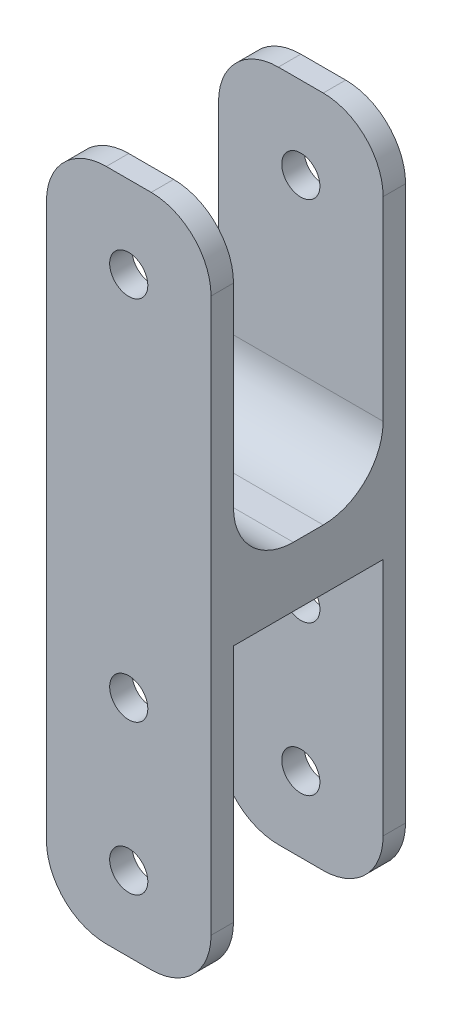
ISO-10303-21;
HEADER;
FILE_DESCRIPTION(('STEP AP214'),'2;1');
FILE_NAME('part.step','',(''),(''),'','','');
FILE_SCHEMA(('AUTOMOTIVE_DESIGN { 1 0 10303 214 1 1 1 1 }'));
ENDSEC;
DATA;
#1=APPLICATION_CONTEXT('core data for automotive mechanical design processes');
#2=APPLICATION_PROTOCOL_DEFINITION('international standard','automotive_design',2000,#1);
#3=PRODUCT_CONTEXT('',#1,'mechanical');
#4=PRODUCT('Part','Part','',(#3));
#5=PRODUCT_RELATED_PRODUCT_CATEGORY('part','',(#4));
#6=PRODUCT_DEFINITION_FORMATION('','',#4);
#7=PRODUCT_DEFINITION_CONTEXT('part definition',#1,'design');
#8=PRODUCT_DEFINITION('design','',#6,#7);
#9=PRODUCT_DEFINITION_SHAPE('','',#8);
#10=(LENGTH_UNIT() NAMED_UNIT(*) SI_UNIT(.MILLI.,.METRE.));
#11=(NAMED_UNIT(*) PLANE_ANGLE_UNIT() SI_UNIT($,.RADIAN.));
#12=(NAMED_UNIT(*) SI_UNIT($,.STERADIAN.) SOLID_ANGLE_UNIT());
#13=UNCERTAINTY_MEASURE_WITH_UNIT(LENGTH_MEASURE(1.E-05),#10,'distance_accuracy_value','');
#14=(GEOMETRIC_REPRESENTATION_CONTEXT(3) GLOBAL_UNCERTAINTY_ASSIGNED_CONTEXT((#13)) GLOBAL_UNIT_ASSIGNED_CONTEXT((#10,
#11,#12)) REPRESENTATION_CONTEXT('',''));
#15=CARTESIAN_POINT('',(0.,0.,0.));
#16=DIRECTION('',(0.,0.,1.));
#17=DIRECTION('',(1.,0.,0.));
#18=AXIS2_PLACEMENT_3D('',#15,#16,#17);
#19=CARTESIAN_POINT('',(22.,0.,9.79381443298968));
#20=DIRECTION('',(0.,1.,0.));
#21=DIRECTION('',(0.,0.,1.));
#22=AXIS2_PLACEMENT_3D('',#19,#20,#21);
#23=PLANE('',#22);
#24=DIRECTION('',(0.,0.,-1.));
#25=VECTOR('',#24,1.);
#26=CARTESIAN_POINT('',(0.,0.,9.79381443298968));
#27=LINE('',#26,#25);
#28=CARTESIAN_POINT('',(0.,0.,9.79381443298968));
#29=VERTEX_POINT('',#28);
#30=CARTESIAN_POINT('',(0.,0.,-10.2061855670103));
#31=VERTEX_POINT('',#30);
#32=EDGE_CURVE('E211',#29,#31,#27,.T.);
#33=ORIENTED_EDGE('',*,*,#32,.T.);
#34=DIRECTION('',(-1.,0.,0.));
#35=VECTOR('',#34,1.);
#36=CARTESIAN_POINT('',(22.,0.,-10.2061855670103));
#37=LINE('',#36,#35);
#38=CARTESIAN_POINT('',(22.,0.,-10.2061855670103));
#39=VERTEX_POINT('',#38);
#40=EDGE_CURVE('E189',#39,#31,#37,.T.);
#41=ORIENTED_EDGE('',*,*,#40,.F.);
#42=DIRECTION('',(0.,0.,-1.));
#43=VECTOR('',#42,1.);
#44=CARTESIAN_POINT('',(22.,0.,9.79381443298968));
#45=LINE('',#44,#43);
#46=CARTESIAN_POINT('',(22.,0.,9.79381443298968));
#47=VERTEX_POINT('',#46);
#48=EDGE_CURVE('E198',#47,#39,#45,.T.);
#49=ORIENTED_EDGE('',*,*,#48,.F.);
#50=DIRECTION('',(-1.,0.,0.));
#51=VECTOR('',#50,1.);
#52=CARTESIAN_POINT('',(22.,0.,9.79381443298968));
#53=LINE('',#52,#51);
#54=EDGE_CURVE('E362',#47,#29,#53,.T.);
#55=ORIENTED_EDGE('',*,*,#54,.T.);
#56=EDGE_LOOP('',(#33,#41,#49,#55));
#57=FACE_BOUND('',#56,.T.);
#58=ADVANCED_FACE('F35',(#57),#23,.F.);
#59=CARTESIAN_POINT('',(22.,0.,-10.2061855670103));
#60=DIRECTION('',(0.,0.,-1.));
#61=DIRECTION('',(0.,1.,0.));
#62=AXIS2_PLACEMENT_3D('',#59,#60,#61);
#63=PLANE('',#62);
#64=CARTESIAN_POINT('',(11.,-30.,-10.2061855670103));
#65=DIRECTION('',(0.,0.,-1.));
#66=DIRECTION('',(0.,1.,0.));
#67=AXIS2_PLACEMENT_3D('',#64,#65,#66);
#68=CIRCLE('',#67,2.55);
#69=CARTESIAN_POINT('',(11.,-27.45,-10.2061855670103));
#70=VERTEX_POINT('',#69);
#71=EDGE_CURVE('E229',#70,#70,#68,.T.);
#72=ORIENTED_EDGE('',*,*,#71,.T.);
#73=EDGE_LOOP('',(#72));
#74=FACE_BOUND('',#73,.T.);
#75=CARTESIAN_POINT('',(11.,-10.,-10.2061855670103));
#76=DIRECTION('',(0.,0.,-1.));
#77=DIRECTION('',(0.,1.,0.));
#78=AXIS2_PLACEMENT_3D('',#75,#76,#77);
#79=CIRCLE('',#78,2.55);
#80=CARTESIAN_POINT('',(11.,-7.45,-10.2061855670103));
#81=VERTEX_POINT('',#80);
#82=EDGE_CURVE('E225',#81,#81,#79,.T.);
#83=ORIENTED_EDGE('',*,*,#82,.T.);
#84=EDGE_LOOP('',(#83));
#85=FACE_BOUND('',#84,.T.);
#86=DIRECTION('',(0.,-1.,0.));
#87=VECTOR('',#86,1.);
#88=CARTESIAN_POINT('',(0.,0.,-10.2061855670103));
#89=LINE('',#88,#87);
#90=CARTESIAN_POINT('',(0.,-32.,-10.2061855670103));
#91=VERTEX_POINT('',#90);
#92=EDGE_CURVE('E364',#31,#91,#89,.T.);
#93=ORIENTED_EDGE('',*,*,#92,.T.);
#94=CARTESIAN_POINT('',(8.,-32.,-10.2061855670103));
#95=DIRECTION('',(0.,0.,-1.));
#96=DIRECTION('',(0.,1.,0.));
#97=AXIS2_PLACEMENT_3D('',#94,#95,#96);
#98=CIRCLE('',#97,8.);
#99=CARTESIAN_POINT('',(8.,-40.,-10.2061855670103));
#100=VERTEX_POINT('',#99);
#101=EDGE_CURVE('E250',#91,#100,#98,.F.);
#102=ORIENTED_EDGE('',*,*,#101,.T.);
#103=DIRECTION('',(-1.,0.,0.));
#104=VECTOR('',#103,1.);
#105=CARTESIAN_POINT('',(22.,-40.,-10.2061855670103));
#106=LINE('',#105,#104);
#107=CARTESIAN_POINT('',(14.,-40.,-10.2061855670103));
#108=VERTEX_POINT('',#107);
#109=EDGE_CURVE('E213',#108,#100,#106,.T.);
#110=ORIENTED_EDGE('',*,*,#109,.F.);
#111=CARTESIAN_POINT('',(14.,-32.,-10.2061855670103));
#112=DIRECTION('',(0.,0.,-1.));
#113=DIRECTION('',(0.,1.,0.));
#114=AXIS2_PLACEMENT_3D('',#111,#112,#113);
#115=CIRCLE('',#114,8.);
#116=CARTESIAN_POINT('',(22.,-32.,-10.2061855670103));
#117=VERTEX_POINT('',#116);
#118=EDGE_CURVE('E193',#108,#117,#115,.F.);
#119=ORIENTED_EDGE('',*,*,#118,.T.);
#120=DIRECTION('',(0.,-1.,0.));
#121=VECTOR('',#120,1.);
#122=CARTESIAN_POINT('',(22.,0.,-10.2061855670103));
#123=LINE('',#122,#121);
#124=EDGE_CURVE('E184',#39,#117,#123,.T.);
#125=ORIENTED_EDGE('',*,*,#124,.F.);
#126=ORIENTED_EDGE('',*,*,#40,.T.);
#127=EDGE_LOOP('',(#93,#102,#110,#119,#125,#126));
#128=FACE_BOUND('',#127,.T.);
#129=ADVANCED_FACE('F187',(#74,#85,#128),#63,.F.);
#130=CARTESIAN_POINT('',(22.,-40.,-10.2061855670103));
#131=DIRECTION('',(0.,1.,0.));
#132=DIRECTION('',(0.,0.,1.));
#133=AXIS2_PLACEMENT_3D('',#130,#131,#132);
#134=PLANE('',#133);
#135=ORIENTED_EDGE('',*,*,#109,.T.);
#136=DIRECTION('',(0.,0.,-1.));
#137=VECTOR('',#136,1.);
#138=CARTESIAN_POINT('',(8.,-40.,-10.2061855670103));
#139=LINE('',#138,#137);
#140=CARTESIAN_POINT('',(8.,-40.,-13.2061855670103));
#141=VERTEX_POINT('',#140);
#142=EDGE_CURVE('E215',#100,#141,#139,.T.);
#143=ORIENTED_EDGE('',*,*,#142,.T.);
#144=DIRECTION('',(-1.,0.,0.));
#145=VECTOR('',#144,1.);
#146=CARTESIAN_POINT('',(22.,-40.,-13.2061855670103));
#147=LINE('',#146,#145);
#148=CARTESIAN_POINT('',(14.,-40.,-13.2061855670103));
#149=VERTEX_POINT('',#148);
#150=EDGE_CURVE('E218',#149,#141,#147,.T.);
#151=ORIENTED_EDGE('',*,*,#150,.F.);
#152=DIRECTION('',(0.,0.,-1.));
#153=VECTOR('',#152,1.);
#154=CARTESIAN_POINT('',(14.,-40.,-10.2061855670103));
#155=LINE('',#154,#153);
#156=EDGE_CURVE('E212',#149,#108,#155,.F.);
#157=ORIENTED_EDGE('',*,*,#156,.T.);
#158=EDGE_LOOP('',(#135,#143,#151,#157));
#159=FACE_BOUND('',#158,.T.);
#160=ADVANCED_FACE('F337',(#159),#134,.F.);
#161=CARTESIAN_POINT('',(22.,-40.,-13.2061855670103));
#162=DIRECTION('',(0.,0.,1.));
#163=DIRECTION('',(0.,-1.,0.));
#164=AXIS2_PLACEMENT_3D('',#161,#162,#163);
#165=PLANE('',#164);
#166=CARTESIAN_POINT('',(11.,-30.,-13.2061855670103));
#167=DIRECTION('',(0.,0.,1.));
#168=DIRECTION('',(1.,0.,0.));
#169=AXIS2_PLACEMENT_3D('',#166,#167,#168);
#170=CIRCLE('',#169,2.55);
#171=CARTESIAN_POINT('',(13.55,-30.,-13.2061855670103));
#172=VERTEX_POINT('',#171);
#173=EDGE_CURVE('E226',#172,#172,#170,.T.);
#174=ORIENTED_EDGE('',*,*,#173,.T.);
#175=EDGE_LOOP('',(#174));
#176=FACE_BOUND('',#175,.T.);
#177=CARTESIAN_POINT('',(11.,-10.,-13.2061855670103));
#178=DIRECTION('',(0.,0.,1.));
#179=DIRECTION('',(1.,0.,0.));
#180=AXIS2_PLACEMENT_3D('',#177,#178,#179);
#181=CIRCLE('',#180,2.55);
#182=CARTESIAN_POINT('',(13.55,-10.,-13.2061855670103));
#183=VERTEX_POINT('',#182);
#184=EDGE_CURVE('E725',#183,#183,#181,.T.);
#185=ORIENTED_EDGE('',*,*,#184,.T.);
#186=EDGE_LOOP('',(#185));
#187=FACE_BOUND('',#186,.T.);
#188=CARTESIAN_POINT('',(11.,39.,-13.2061855670103));
#189=DIRECTION('',(0.,0.,1.));
#190=DIRECTION('',(1.,0.,0.));
#191=AXIS2_PLACEMENT_3D('',#188,#189,#190);
#192=CIRCLE('',#191,2.55);
#193=CARTESIAN_POINT('',(13.55,39.,-13.2061855670103));
#194=VERTEX_POINT('',#193);
#195=EDGE_CURVE('E701',#194,#194,#192,.T.);
#196=ORIENTED_EDGE('',*,*,#195,.T.);
#197=EDGE_LOOP('',(#196));
#198=FACE_BOUND('',#197,.T.);
#199=ORIENTED_EDGE('',*,*,#150,.T.);
#200=CARTESIAN_POINT('',(8.,-32.,-13.2061855670103));
#201=DIRECTION('',(0.,0.,1.));
#202=DIRECTION('',(0.,-1.,0.));
#203=AXIS2_PLACEMENT_3D('',#200,#201,#202);
#204=CIRCLE('',#203,8.);
#205=CARTESIAN_POINT('',(0.,-32.,-13.2061855670103));
#206=VERTEX_POINT('',#205);
#207=EDGE_CURVE('E239',#141,#206,#204,.F.);
#208=ORIENTED_EDGE('',*,*,#207,.T.);
#209=DIRECTION('',(0.,1.,0.));
#210=VECTOR('',#209,1.);
#211=CARTESIAN_POINT('',(0.,-40.,-13.2061855670103));
#212=LINE('',#211,#210);
#213=CARTESIAN_POINT('',(0.,42.,-13.2061855670103));
#214=VERTEX_POINT('',#213);
#215=EDGE_CURVE('E367',#206,#214,#212,.T.);
#216=ORIENTED_EDGE('',*,*,#215,.T.);
#217=CARTESIAN_POINT('',(8.,42.,-13.2061855670103));
#218=DIRECTION('',(0.,0.,1.));
#219=DIRECTION('',(0.,-1.,0.));
#220=AXIS2_PLACEMENT_3D('',#217,#218,#219);
#221=CIRCLE('',#220,8.);
#222=CARTESIAN_POINT('',(8.,50.,-13.2061855670103));
#223=VERTEX_POINT('',#222);
#224=EDGE_CURVE('E235',#214,#223,#221,.F.);
#225=ORIENTED_EDGE('',*,*,#224,.T.);
#226=DIRECTION('',(-1.,0.,0.));
#227=VECTOR('',#226,1.);
#228=CARTESIAN_POINT('',(22.,50.,-13.2061855670103));
#229=LINE('',#228,#227);
#230=CARTESIAN_POINT('',(14.,50.,-13.2061855670103));
#231=VERTEX_POINT('',#230);
#232=EDGE_CURVE('E326',#231,#223,#229,.T.);
#233=ORIENTED_EDGE('',*,*,#232,.F.);
#234=CARTESIAN_POINT('',(14.,42.,-13.2061855670103));
#235=DIRECTION('',(0.,0.,1.));
#236=DIRECTION('',(0.,-1.,0.));
#237=AXIS2_PLACEMENT_3D('',#234,#235,#236);
#238=CIRCLE('',#237,8.);
#239=CARTESIAN_POINT('',(22.,42.,-13.2061855670103));
#240=VERTEX_POINT('',#239);
#241=EDGE_CURVE('E233',#231,#240,#238,.F.);
#242=ORIENTED_EDGE('',*,*,#241,.T.);
#243=DIRECTION('',(0.,1.,0.));
#244=VECTOR('',#243,1.);
#245=CARTESIAN_POINT('',(22.,-40.,-13.2061855670103));
#246=LINE('',#245,#244);
#247=CARTESIAN_POINT('',(22.,-32.,-13.2061855670103));
#248=VERTEX_POINT('',#247);
#249=EDGE_CURVE('E197',#248,#240,#246,.T.);
#250=ORIENTED_EDGE('',*,*,#249,.F.);
#251=CARTESIAN_POINT('',(14.,-32.,-13.2061855670103));
#252=DIRECTION('',(0.,0.,1.));
#253=DIRECTION('',(0.,-1.,0.));
#254=AXIS2_PLACEMENT_3D('',#251,#252,#253);
#255=CIRCLE('',#254,8.);
#256=EDGE_CURVE('E237',#248,#149,#255,.F.);
#257=ORIENTED_EDGE('',*,*,#256,.T.);
#258=EDGE_LOOP('',(#199,#208,#216,#225,#233,#242,#250,#257));
#259=FACE_BOUND('',#258,.T.);
#260=ADVANCED_FACE('F331',(#176,#187,#198,#259),#165,.F.);
#261=CARTESIAN_POINT('',(22.,50.,-13.2061855670103));
#262=DIRECTION('',(0.,-1.,0.));
#263=DIRECTION('',(0.,0.,-1.));
#264=AXIS2_PLACEMENT_3D('',#261,#262,#263);
#265=PLANE('',#264);
#266=ORIENTED_EDGE('',*,*,#232,.T.);
#267=DIRECTION('',(0.,0.,1.));
#268=VECTOR('',#267,1.);
#269=CARTESIAN_POINT('',(8.,50.,-13.2061855670103));
#270=LINE('',#269,#268);
#271=CARTESIAN_POINT('',(8.,50.,-10.2061855670103));
#272=VERTEX_POINT('',#271);
#273=EDGE_CURVE('E281',#223,#272,#270,.T.);
#274=ORIENTED_EDGE('',*,*,#273,.T.);
#275=DIRECTION('',(-1.,0.,0.));
#276=VECTOR('',#275,1.);
#277=CARTESIAN_POINT('',(22.,50.,-10.2061855670103));
#278=LINE('',#277,#276);
#279=CARTESIAN_POINT('',(14.,50.,-10.2061855670103));
#280=VERTEX_POINT('',#279);
#281=EDGE_CURVE('E323',#280,#272,#278,.T.);
#282=ORIENTED_EDGE('',*,*,#281,.F.);
#283=DIRECTION('',(0.,0.,1.));
#284=VECTOR('',#283,1.);
#285=CARTESIAN_POINT('',(14.,50.,-13.2061855670103));
#286=LINE('',#285,#284);
#287=EDGE_CURVE('E279',#280,#231,#286,.F.);
#288=ORIENTED_EDGE('',*,*,#287,.T.);
#289=EDGE_LOOP('',(#266,#274,#282,#288));
#290=FACE_BOUND('',#289,.T.);
#291=ADVANCED_FACE('F477',(#290),#265,.F.);
#292=CARTESIAN_POINT('',(22.,50.,-10.2061855670103));
#293=DIRECTION('',(0.,0.,-1.));
#294=DIRECTION('',(0.,1.,0.));
#295=AXIS2_PLACEMENT_3D('',#292,#293,#294);
#296=PLANE('',#295);
#297=CARTESIAN_POINT('',(11.,39.,-10.2061855670103));
#298=DIRECTION('',(0.,0.,-1.));
#299=DIRECTION('',(0.,1.,0.));
#300=AXIS2_PLACEMENT_3D('',#297,#298,#299);
#301=CIRCLE('',#300,2.55);
#302=CARTESIAN_POINT('',(11.,41.55,-10.2061855670103));
#303=VERTEX_POINT('',#302);
#304=EDGE_CURVE('E365',#303,#303,#301,.T.);
#305=ORIENTED_EDGE('',*,*,#304,.T.);
#306=EDGE_LOOP('',(#305));
#307=FACE_BOUND('',#306,.T.);
#308=ORIENTED_EDGE('',*,*,#281,.T.);
#309=CARTESIAN_POINT('',(8.,42.,-10.2061855670103));
#310=DIRECTION('',(0.,0.,-1.));
#311=DIRECTION('',(0.,1.,0.));
#312=AXIS2_PLACEMENT_3D('',#309,#310,#311);
#313=CIRCLE('',#312,8.);
#314=CARTESIAN_POINT('',(0.,42.,-10.2061855670103));
#315=VERTEX_POINT('',#314);
#316=EDGE_CURVE('E286',#272,#315,#313,.F.);
#317=ORIENTED_EDGE('',*,*,#316,.T.);
#318=DIRECTION('',(0.,-1.,0.));
#319=VECTOR('',#318,1.);
#320=CARTESIAN_POINT('',(0.,50.,-10.2061855670103));
#321=LINE('',#320,#319);
#322=CARTESIAN_POINT('',(0.,16.,-10.2061855670103));
#323=VERTEX_POINT('',#322);
#324=EDGE_CURVE('E369',#315,#323,#321,.T.);
#325=ORIENTED_EDGE('',*,*,#324,.T.);
#326=DIRECTION('',(-1.,0.,0.));
#327=VECTOR('',#326,1.);
#328=CARTESIAN_POINT('',(22.,16.,-10.2061855670103));
#329=LINE('',#328,#327);
#330=CARTESIAN_POINT('',(22.,16.,-10.2061855670103));
#331=VERTEX_POINT('',#330);
#332=EDGE_CURVE('E320',#331,#323,#329,.T.);
#333=ORIENTED_EDGE('',*,*,#332,.F.);
#334=DIRECTION('',(0.,-1.,0.));
#335=VECTOR('',#334,1.);
#336=CARTESIAN_POINT('',(22.,50.,-10.2061855670103));
#337=LINE('',#336,#335);
#338=CARTESIAN_POINT('',(22.,42.,-10.2061855670103));
#339=VERTEX_POINT('',#338);
#340=EDGE_CURVE('E345',#339,#331,#337,.T.);
#341=ORIENTED_EDGE('',*,*,#340,.F.);
#342=CARTESIAN_POINT('',(14.,42.,-10.2061855670103));
#343=DIRECTION('',(0.,0.,-1.));
#344=DIRECTION('',(0.,1.,0.));
#345=AXIS2_PLACEMENT_3D('',#342,#343,#344);
#346=CIRCLE('',#345,8.);
#347=EDGE_CURVE('E284',#339,#280,#346,.F.);
#348=ORIENTED_EDGE('',*,*,#347,.T.);
#349=EDGE_LOOP('',(#308,#317,#325,#333,#341,#348));
#350=FACE_BOUND('',#349,.T.);
#351=ADVANCED_FACE('F449',(#307,#350),#296,.F.);
#352=CARTESIAN_POINT('',(22.,16.,-2.20618556701032));
#353=DIRECTION('',(-1.,0.,0.));
#354=DIRECTION('',(0.,0.,1.));
#355=AXIS2_PLACEMENT_3D('',#352,#353,#354);
#356=CYLINDRICAL_SURFACE('',#355,8.);
#357=CARTESIAN_POINT('',(0.,16.,-2.20618556701032));
#358=DIRECTION('',(-1.,0.,0.));
#359=DIRECTION('',(0.,0.,-1.));
#360=AXIS2_PLACEMENT_3D('',#357,#358,#359);
#361=CIRCLE('',#360,8.);
#362=CARTESIAN_POINT('',(0.,8.,-2.20618556701032));
#363=VERTEX_POINT('',#362);
#364=EDGE_CURVE('E371',#323,#363,#361,.T.);
#365=ORIENTED_EDGE('',*,*,#364,.T.);
#366=DIRECTION('',(-1.,0.,0.));
#367=VECTOR('',#366,1.);
#368=CARTESIAN_POINT('',(22.,8.,-2.20618556701032));
#369=LINE('',#368,#367);
#370=CARTESIAN_POINT('',(22.,8.,-2.20618556701032));
#371=VERTEX_POINT('',#370);
#372=EDGE_CURVE('E317',#371,#363,#369,.T.);
#373=ORIENTED_EDGE('',*,*,#372,.F.);
#374=CARTESIAN_POINT('',(22.,16.,-2.20618556701032));
#375=DIRECTION('',(-1.,0.,0.));
#376=DIRECTION('',(0.,0.,-1.));
#377=AXIS2_PLACEMENT_3D('',#374,#375,#376);
#378=CIRCLE('',#377,8.);
#379=EDGE_CURVE('E347',#331,#371,#378,.T.);
#380=ORIENTED_EDGE('',*,*,#379,.F.);
#381=ORIENTED_EDGE('',*,*,#332,.T.);
#382=EDGE_LOOP('',(#365,#373,#380,#381));
#383=FACE_BOUND('',#382,.T.);
#384=ADVANCED_FACE('F456',(#383),#356,.F.);
#385=CARTESIAN_POINT('',(22.,8.,1.79381443298967));
#386=DIRECTION('',(0.,-1.,0.));
#387=DIRECTION('',(0.,0.,-1.));
#388=AXIS2_PLACEMENT_3D('',#385,#386,#387);
#389=PLANE('',#388);
#390=DIRECTION('',(0.,0.,1.));
#391=VECTOR('',#390,1.);
#392=CARTESIAN_POINT('',(0.,8.,1.79381443298967));
#393=LINE('',#392,#391);
#394=CARTESIAN_POINT('',(0.,8.,1.79381443298967));
#395=VERTEX_POINT('',#394);
#396=EDGE_CURVE('E373',#363,#395,#393,.T.);
#397=ORIENTED_EDGE('',*,*,#396,.T.);
#398=DIRECTION('',(-1.,0.,0.));
#399=VECTOR('',#398,1.);
#400=CARTESIAN_POINT('',(22.,8.,1.79381443298967));
#401=LINE('',#400,#399);
#402=CARTESIAN_POINT('',(22.,8.,1.79381443298967));
#403=VERTEX_POINT('',#402);
#404=EDGE_CURVE('E314',#403,#395,#401,.T.);
#405=ORIENTED_EDGE('',*,*,#404,.F.);
#406=DIRECTION('',(0.,0.,1.));
#407=VECTOR('',#406,1.);
#408=CARTESIAN_POINT('',(22.,8.,1.79381443298967));
#409=LINE('',#408,#407);
#410=EDGE_CURVE('E351',#371,#403,#409,.T.);
#411=ORIENTED_EDGE('',*,*,#410,.F.);
#412=ORIENTED_EDGE('',*,*,#372,.T.);
#413=EDGE_LOOP('',(#397,#405,#411,#412));
#414=FACE_BOUND('',#413,.T.);
#415=ADVANCED_FACE('F460',(#414),#389,.F.);
#416=CARTESIAN_POINT('',(22.,16.,1.79381443298967));
#417=DIRECTION('',(-1.,0.,0.));
#418=DIRECTION('',(0.,0.,1.));
#419=AXIS2_PLACEMENT_3D('',#416,#417,#418);
#420=CYLINDRICAL_SURFACE('',#419,8.);
#421=CARTESIAN_POINT('',(0.,16.,1.79381443298967));
#422=DIRECTION('',(-1.,0.,0.));
#423=DIRECTION('',(0.,0.,1.));
#424=AXIS2_PLACEMENT_3D('',#421,#422,#423);
#425=CIRCLE('',#424,8.);
#426=CARTESIAN_POINT('',(0.,16.,9.79381443298967));
#427=VERTEX_POINT('',#426);
#428=EDGE_CURVE('E375',#395,#427,#425,.T.);
#429=ORIENTED_EDGE('',*,*,#428,.T.);
#430=DIRECTION('',(-1.,0.,0.));
#431=VECTOR('',#430,1.);
#432=CARTESIAN_POINT('',(22.,16.,9.79381443298967));
#433=LINE('',#432,#431);
#434=CARTESIAN_POINT('',(22.,16.,9.79381443298967));
#435=VERTEX_POINT('',#434);
#436=EDGE_CURVE('E305',#435,#427,#433,.T.);
#437=ORIENTED_EDGE('',*,*,#436,.F.);
#438=CARTESIAN_POINT('',(22.,16.,1.79381443298967));
#439=DIRECTION('',(-1.,0.,0.));
#440=DIRECTION('',(0.,0.,1.));
#441=AXIS2_PLACEMENT_3D('',#438,#439,#440);
#442=CIRCLE('',#441,8.);
#443=EDGE_CURVE('E353',#403,#435,#442,.T.);
#444=ORIENTED_EDGE('',*,*,#443,.F.);
#445=ORIENTED_EDGE('',*,*,#404,.T.);
#446=EDGE_LOOP('',(#429,#437,#444,#445));
#447=FACE_BOUND('',#446,.T.);
#448=ADVANCED_FACE('F461',(#447),#420,.F.);
#449=CARTESIAN_POINT('',(22.,16.,9.79381443298967));
#450=DIRECTION('',(0.,0.,1.));
#451=DIRECTION('',(0.,-1.,0.));
#452=AXIS2_PLACEMENT_3D('',#449,#450,#451);
#453=PLANE('',#452);
#454=CARTESIAN_POINT('',(11.,39.,9.79381443298968));
#455=DIRECTION('',(0.,0.,1.));
#456=DIRECTION('',(0.,-1.,0.));
#457=AXIS2_PLACEMENT_3D('',#454,#455,#456);
#458=CIRCLE('',#457,2.55);
#459=CARTESIAN_POINT('',(11.,36.45,9.79381443298968));
#460=VERTEX_POINT('',#459);
#461=EDGE_CURVE('E711',#460,#460,#458,.T.);
#462=ORIENTED_EDGE('',*,*,#461,.T.);
#463=EDGE_LOOP('',(#462));
#464=FACE_BOUND('',#463,.T.);
#465=DIRECTION('',(-1.,0.,0.));
#466=VECTOR('',#465,1.);
#467=CARTESIAN_POINT('',(22.,50.,9.79381443298968));
#468=LINE('',#467,#466);
#469=CARTESIAN_POINT('',(14.,50.,9.79381443298968));
#470=VERTEX_POINT('',#469);
#471=CARTESIAN_POINT('',(8.,50.,9.79381443298968));
#472=VERTEX_POINT('',#471);
#473=EDGE_CURVE('E295',#470,#472,#468,.T.);
#474=ORIENTED_EDGE('',*,*,#473,.F.);
#475=CARTESIAN_POINT('',(14.,42.,9.79381443298968));
#476=DIRECTION('',(0.,0.,1.));
#477=DIRECTION('',(0.,-1.,0.));
#478=AXIS2_PLACEMENT_3D('',#475,#476,#477);
#479=CIRCLE('',#478,8.);
#480=CARTESIAN_POINT('',(22.,42.,9.79381443298968));
#481=VERTEX_POINT('',#480);
#482=EDGE_CURVE('E11',#470,#481,#479,.F.);
#483=ORIENTED_EDGE('',*,*,#482,.T.);
#484=DIRECTION('',(0.,1.,0.));
#485=VECTOR('',#484,1.);
#486=CARTESIAN_POINT('',(22.,16.,9.79381443298967));
#487=LINE('',#486,#485);
#488=EDGE_CURVE('E355',#435,#481,#487,.T.);
#489=ORIENTED_EDGE('',*,*,#488,.F.);
#490=ORIENTED_EDGE('',*,*,#436,.T.);
#491=DIRECTION('',(0.,1.,0.));
#492=VECTOR('',#491,1.);
#493=CARTESIAN_POINT('',(0.,16.,9.79381443298967));
#494=LINE('',#493,#492);
#495=CARTESIAN_POINT('',(0.,42.,9.79381443298968));
#496=VERTEX_POINT('',#495);
#497=EDGE_CURVE('E377',#427,#496,#494,.T.);
#498=ORIENTED_EDGE('',*,*,#497,.T.);
#499=CARTESIAN_POINT('',(8.,42.,9.79381443298968));
#500=DIRECTION('',(0.,0.,1.));
#501=DIRECTION('',(0.,-1.,0.));
#502=AXIS2_PLACEMENT_3D('',#499,#500,#501);
#503=CIRCLE('',#502,8.);
#504=EDGE_CURVE('E43',#496,#472,#503,.F.);
#505=ORIENTED_EDGE('',*,*,#504,.T.);
#506=EDGE_LOOP('',(#474,#483,#489,#490,#498,#505));
#507=FACE_BOUND('',#506,.T.);
#508=ADVANCED_FACE('F400',(#464,#507),#453,.F.);
#509=CARTESIAN_POINT('',(22.,50.,9.79381443298968));
#510=DIRECTION('',(0.,-1.,0.));
#511=DIRECTION('',(0.,0.,-1.));
#512=AXIS2_PLACEMENT_3D('',#509,#510,#511);
#513=PLANE('',#512);
#514=DIRECTION('',(-1.,0.,0.));
#515=VECTOR('',#514,1.);
#516=CARTESIAN_POINT('',(22.,50.,12.7938144329897));
#517=LINE('',#516,#515);
#518=CARTESIAN_POINT('',(14.,50.,12.7938144329897));
#519=VERTEX_POINT('',#518);
#520=CARTESIAN_POINT('',(8.,50.,12.7938144329897));
#521=VERTEX_POINT('',#520);
#522=EDGE_CURVE('E294',#519,#521,#517,.T.);
#523=ORIENTED_EDGE('',*,*,#522,.F.);
#524=DIRECTION('',(0.,0.,1.));
#525=VECTOR('',#524,1.);
#526=CARTESIAN_POINT('',(14.,50.,9.79381443298968));
#527=LINE('',#526,#525);
#528=EDGE_CURVE('E56',#519,#470,#527,.F.);
#529=ORIENTED_EDGE('',*,*,#528,.T.);
#530=ORIENTED_EDGE('',*,*,#473,.T.);
#531=DIRECTION('',(0.,0.,1.));
#532=VECTOR('',#531,1.);
#533=CARTESIAN_POINT('',(8.,50.,9.79381443298968));
#534=LINE('',#533,#532);
#535=EDGE_CURVE('E288',#472,#521,#534,.T.);
#536=ORIENTED_EDGE('',*,*,#535,.T.);
#537=EDGE_LOOP('',(#523,#529,#530,#536));
#538=FACE_BOUND('',#537,.T.);
#539=ADVANCED_FACE('F293',(#538),#513,.F.);
#540=CARTESIAN_POINT('',(22.,50.,12.7938144329897));
#541=DIRECTION('',(0.,0.,-1.));
#542=DIRECTION('',(0.,1.,0.));
#543=AXIS2_PLACEMENT_3D('',#540,#541,#542);
#544=PLANE('',#543);
#545=CARTESIAN_POINT('',(11.,-30.,12.7938144329897));
#546=DIRECTION('',(0.,0.,1.));
#547=DIRECTION('',(1.,0.,0.));
#548=AXIS2_PLACEMENT_3D('',#545,#546,#547);
#549=CIRCLE('',#548,2.55);
#550=CARTESIAN_POINT('',(13.55,-30.,12.7938144329897));
#551=VERTEX_POINT('',#550);
#552=EDGE_CURVE('E693',#551,#551,#549,.T.);
#553=ORIENTED_EDGE('',*,*,#552,.F.);
#554=EDGE_LOOP('',(#553));
#555=FACE_BOUND('',#554,.T.);
#556=CARTESIAN_POINT('',(11.,-10.,12.7938144329897));
#557=DIRECTION('',(0.,0.,1.));
#558=DIRECTION('',(1.,0.,0.));
#559=AXIS2_PLACEMENT_3D('',#556,#557,#558);
#560=CIRCLE('',#559,2.55);
#561=CARTESIAN_POINT('',(13.55,-10.,12.7938144329897));
#562=VERTEX_POINT('',#561);
#563=EDGE_CURVE('E697',#562,#562,#560,.T.);
#564=ORIENTED_EDGE('',*,*,#563,.F.);
#565=EDGE_LOOP('',(#564));
#566=FACE_BOUND('',#565,.T.);
#567=CARTESIAN_POINT('',(11.,39.,12.7938144329897));
#568=DIRECTION('',(0.,0.,1.));
#569=DIRECTION('',(1.,0.,0.));
#570=AXIS2_PLACEMENT_3D('',#567,#568,#569);
#571=CIRCLE('',#570,2.55);
#572=CARTESIAN_POINT('',(13.55,39.,12.7938144329897));
#573=VERTEX_POINT('',#572);
#574=EDGE_CURVE('E700',#573,#573,#571,.T.);
#575=ORIENTED_EDGE('',*,*,#574,.F.);
#576=EDGE_LOOP('',(#575));
#577=FACE_BOUND('',#576,.T.);
#578=DIRECTION('',(-1.,0.,0.));
#579=VECTOR('',#578,1.);
#580=CARTESIAN_POINT('',(22.,-40.,12.7938144329897));
#581=LINE('',#580,#579);
#582=CARTESIAN_POINT('',(14.,-40.,12.7938144329897));
#583=VERTEX_POINT('',#582);
#584=CARTESIAN_POINT('',(8.,-40.,12.7938144329897));
#585=VERTEX_POINT('',#584);
#586=EDGE_CURVE('E303',#583,#585,#581,.T.);
#587=ORIENTED_EDGE('',*,*,#586,.F.);
#588=CARTESIAN_POINT('',(14.,-32.,12.7938144329897));
#589=DIRECTION('',(0.,0.,-1.));
#590=DIRECTION('',(0.,1.,0.));
#591=AXIS2_PLACEMENT_3D('',#588,#589,#590);
#592=CIRCLE('',#591,8.);
#593=CARTESIAN_POINT('',(22.,-32.,12.7938144329897));
#594=VERTEX_POINT('',#593);
#595=EDGE_CURVE('E277',#583,#594,#592,.F.);
#596=ORIENTED_EDGE('',*,*,#595,.T.);
#597=DIRECTION('',(0.,-1.,0.));
#598=VECTOR('',#597,1.);
#599=CARTESIAN_POINT('',(22.,50.,12.7938144329897));
#600=LINE('',#599,#598);
#601=CARTESIAN_POINT('',(22.,42.,12.7938144329897));
#602=VERTEX_POINT('',#601);
#603=EDGE_CURVE('E358',#602,#594,#600,.T.);
#604=ORIENTED_EDGE('',*,*,#603,.F.);
#605=CARTESIAN_POINT('',(14.,42.,12.7938144329897));
#606=DIRECTION('',(0.,0.,-1.));
#607=DIRECTION('',(0.,1.,0.));
#608=AXIS2_PLACEMENT_3D('',#605,#606,#607);
#609=CIRCLE('',#608,8.);
#610=EDGE_CURVE('E273',#602,#519,#609,.F.);
#611=ORIENTED_EDGE('',*,*,#610,.T.);
#612=ORIENTED_EDGE('',*,*,#522,.T.);
#613=CARTESIAN_POINT('',(8.,42.,12.7938144329897));
#614=DIRECTION('',(0.,0.,-1.));
#615=DIRECTION('',(0.,1.,0.));
#616=AXIS2_PLACEMENT_3D('',#613,#614,#615);
#617=CIRCLE('',#616,8.);
#618=CARTESIAN_POINT('',(0.,42.,12.7938144329897));
#619=VERTEX_POINT('',#618);
#620=EDGE_CURVE('E271',#521,#619,#617,.F.);
#621=ORIENTED_EDGE('',*,*,#620,.T.);
#622=DIRECTION('',(0.,-1.,0.));
#623=VECTOR('',#622,1.);
#624=CARTESIAN_POINT('',(0.,50.,12.7938144329897));
#625=LINE('',#624,#623);
#626=CARTESIAN_POINT('',(0.,-32.,12.7938144329897));
#627=VERTEX_POINT('',#626);
#628=EDGE_CURVE('E379',#619,#627,#625,.T.);
#629=ORIENTED_EDGE('',*,*,#628,.T.);
#630=CARTESIAN_POINT('',(8.,-32.,12.7938144329897));
#631=DIRECTION('',(0.,0.,-1.));
#632=DIRECTION('',(0.,1.,0.));
#633=AXIS2_PLACEMENT_3D('',#630,#631,#632);
#634=CIRCLE('',#633,8.);
#635=EDGE_CURVE('E275',#627,#585,#634,.F.);
#636=ORIENTED_EDGE('',*,*,#635,.T.);
#637=EDGE_LOOP('',(#587,#596,#604,#611,#612,#621,#629,#636));
#638=FACE_BOUND('',#637,.T.);
#639=ADVANCED_FACE('F299',(#555,#566,#577,#638),#544,.F.);
#640=CARTESIAN_POINT('',(22.,-40.,12.7938144329897));
#641=DIRECTION('',(0.,1.,0.));
#642=DIRECTION('',(0.,0.,1.));
#643=AXIS2_PLACEMENT_3D('',#640,#641,#642);
#644=PLANE('',#643);
#645=DIRECTION('',(-1.,0.,0.));
#646=VECTOR('',#645,1.);
#647=CARTESIAN_POINT('',(22.,-40.,9.79381443298966));
#648=LINE('',#647,#646);
#649=CARTESIAN_POINT('',(14.,-40.,9.79381443298966));
#650=VERTEX_POINT('',#649);
#651=CARTESIAN_POINT('',(8.,-40.,9.79381443298966));
#652=VERTEX_POINT('',#651);
#653=EDGE_CURVE('E308',#650,#652,#648,.T.);
#654=ORIENTED_EDGE('',*,*,#653,.F.);
#655=DIRECTION('',(0.,0.,-1.));
#656=VECTOR('',#655,1.);
#657=CARTESIAN_POINT('',(14.,-40.,12.7938144329897));
#658=LINE('',#657,#656);
#659=EDGE_CURVE('E269',#650,#583,#658,.F.);
#660=ORIENTED_EDGE('',*,*,#659,.T.);
#661=ORIENTED_EDGE('',*,*,#586,.T.);
#662=DIRECTION('',(0.,0.,-1.));
#663=VECTOR('',#662,1.);
#664=CARTESIAN_POINT('',(8.,-40.,12.7938144329897));
#665=LINE('',#664,#663);
#666=EDGE_CURVE('E266',#585,#652,#665,.T.);
#667=ORIENTED_EDGE('',*,*,#666,.T.);
#668=EDGE_LOOP('',(#654,#660,#661,#667));
#669=FACE_BOUND('',#668,.T.);
#670=ADVANCED_FACE('F389',(#669),#644,.F.);
#671=CARTESIAN_POINT('',(22.,-40.,9.79381443298966));
#672=DIRECTION('',(0.,0.,1.));
#673=DIRECTION('',(0.,-1.,0.));
#674=AXIS2_PLACEMENT_3D('',#671,#672,#673);
#675=PLANE('',#674);
#676=CARTESIAN_POINT('',(11.,-30.,9.79381443298966));
#677=DIRECTION('',(0.,0.,1.));
#678=DIRECTION('',(0.,-1.,0.));
#679=AXIS2_PLACEMENT_3D('',#676,#677,#678);
#680=CIRCLE('',#679,2.55);
#681=CARTESIAN_POINT('',(11.,-32.55,9.79381443298966));
#682=VERTEX_POINT('',#681);
#683=EDGE_CURVE('E227',#682,#682,#680,.T.);
#684=ORIENTED_EDGE('',*,*,#683,.T.);
#685=EDGE_LOOP('',(#684));
#686=FACE_BOUND('',#685,.T.);
#687=CARTESIAN_POINT('',(11.,-10.,9.79381443298967));
#688=DIRECTION('',(0.,0.,1.));
#689=DIRECTION('',(0.,-1.,0.));
#690=AXIS2_PLACEMENT_3D('',#687,#688,#689);
#691=CIRCLE('',#690,2.55);
#692=CARTESIAN_POINT('',(11.,-12.55,9.79381443298967));
#693=VERTEX_POINT('',#692);
#694=EDGE_CURVE('E222',#693,#693,#691,.T.);
#695=ORIENTED_EDGE('',*,*,#694,.T.);
#696=EDGE_LOOP('',(#695));
#697=FACE_BOUND('',#696,.T.);
#698=DIRECTION('',(0.,1.,0.));
#699=VECTOR('',#698,1.);
#700=CARTESIAN_POINT('',(22.,-40.,9.79381443298966));
#701=LINE('',#700,#699);
#702=CARTESIAN_POINT('',(22.,-32.,9.79381443298966));
#703=VERTEX_POINT('',#702);
#704=EDGE_CURVE('E204',#703,#47,#701,.T.);
#705=ORIENTED_EDGE('',*,*,#704,.F.);
#706=CARTESIAN_POINT('',(14.,-32.,9.79381443298967));
#707=DIRECTION('',(0.,0.,1.));
#708=DIRECTION('',(0.,-1.,0.));
#709=AXIS2_PLACEMENT_3D('',#706,#707,#708);
#710=CIRCLE('',#709,8.);
#711=EDGE_CURVE('E264',#703,#650,#710,.F.);
#712=ORIENTED_EDGE('',*,*,#711,.T.);
#713=ORIENTED_EDGE('',*,*,#653,.T.);
#714=CARTESIAN_POINT('',(8.,-32.,9.79381443298967));
#715=DIRECTION('',(0.,0.,1.));
#716=DIRECTION('',(0.,-1.,0.));
#717=AXIS2_PLACEMENT_3D('',#714,#715,#716);
#718=CIRCLE('',#717,8.);
#719=CARTESIAN_POINT('',(0.,-32.,9.79381443298966));
#720=VERTEX_POINT('',#719);
#721=EDGE_CURVE('E262',#652,#720,#718,.F.);
#722=ORIENTED_EDGE('',*,*,#721,.T.);
#723=DIRECTION('',(0.,1.,0.));
#724=VECTOR('',#723,1.);
#725=CARTESIAN_POINT('',(0.,-40.,9.79381443298966));
#726=LINE('',#725,#724);
#727=EDGE_CURVE('E208',#720,#29,#726,.T.);
#728=ORIENTED_EDGE('',*,*,#727,.T.);
#729=ORIENTED_EDGE('',*,*,#54,.F.);
#730=EDGE_LOOP('',(#705,#712,#713,#722,#728,#729));
#731=FACE_BOUND('',#730,.T.);
#732=ADVANCED_FACE('F385',(#686,#697,#731),#675,.F.);
#733=CARTESIAN_POINT('',(22.,16.,-2.20618556701032));
#734=DIRECTION('',(1.,0.,0.));
#735=DIRECTION('',(0.,0.,-1.));
#736=AXIS2_PLACEMENT_3D('',#733,#734,#735);
#737=PLANE('',#736);
#738=ORIENTED_EDGE('',*,*,#124,.T.);
#739=DIRECTION('',(0.,0.,-1.));
#740=VECTOR('',#739,1.);
#741=CARTESIAN_POINT('',(22.,-32.,-13.2061855670103));
#742=LINE('',#741,#740);
#743=EDGE_CURVE('E260',#117,#248,#742,.T.);
#744=ORIENTED_EDGE('',*,*,#743,.T.);
#745=ORIENTED_EDGE('',*,*,#249,.T.);
#746=DIRECTION('',(0.,0.,1.));
#747=VECTOR('',#746,1.);
#748=CARTESIAN_POINT('',(22.,42.,-10.2061855670103));
#749=LINE('',#748,#747);
#750=EDGE_CURVE('E255',#240,#339,#749,.T.);
#751=ORIENTED_EDGE('',*,*,#750,.T.);
#752=ORIENTED_EDGE('',*,*,#340,.T.);
#753=ORIENTED_EDGE('',*,*,#379,.T.);
#754=ORIENTED_EDGE('',*,*,#410,.T.);
#755=ORIENTED_EDGE('',*,*,#443,.T.);
#756=ORIENTED_EDGE('',*,*,#488,.T.);
#757=DIRECTION('',(0.,0.,1.));
#758=VECTOR('',#757,1.);
#759=CARTESIAN_POINT('',(22.,42.,12.7938144329897));
#760=LINE('',#759,#758);
#761=EDGE_CURVE('E252',#481,#602,#760,.T.);
#762=ORIENTED_EDGE('',*,*,#761,.T.);
#763=ORIENTED_EDGE('',*,*,#603,.T.);
#764=DIRECTION('',(0.,0.,-1.));
#765=VECTOR('',#764,1.);
#766=CARTESIAN_POINT('',(22.,-32.,9.79381443298966));
#767=LINE('',#766,#765);
#768=EDGE_CURVE('E258',#594,#703,#767,.T.);
#769=ORIENTED_EDGE('',*,*,#768,.T.);
#770=ORIENTED_EDGE('',*,*,#704,.T.);
#771=ORIENTED_EDGE('',*,*,#48,.T.);
#772=EDGE_LOOP('',(#738,#744,#745,#751,#752,#753,#754,#755,#756,#762,#763,#769,#770,#771));
#773=FACE_BOUND('',#772,.T.);
#774=ADVANCED_FACE('F201',(#773),#737,.T.);
#775=CARTESIAN_POINT('',(0.,16.,-2.20618556701032));
#776=DIRECTION('',(1.,0.,0.));
#777=DIRECTION('',(0.,0.,-1.));
#778=AXIS2_PLACEMENT_3D('',#775,#776,#777);
#779=PLANE('',#778);
#780=ORIENTED_EDGE('',*,*,#215,.F.);
#781=DIRECTION('',(0.,0.,-1.));
#782=VECTOR('',#781,1.);
#783=CARTESIAN_POINT('',(0.,-32.,-2.20618556701032));
#784=LINE('',#783,#782);
#785=EDGE_CURVE('E247',#206,#91,#784,.F.);
#786=ORIENTED_EDGE('',*,*,#785,.T.);
#787=ORIENTED_EDGE('',*,*,#92,.F.);
#788=ORIENTED_EDGE('',*,*,#32,.F.);
#789=ORIENTED_EDGE('',*,*,#727,.F.);
#790=DIRECTION('',(0.,0.,-1.));
#791=VECTOR('',#790,1.);
#792=CARTESIAN_POINT('',(0.,-32.,-2.20618556701032));
#793=LINE('',#792,#791);
#794=EDGE_CURVE('E245',#720,#627,#793,.F.);
#795=ORIENTED_EDGE('',*,*,#794,.T.);
#796=ORIENTED_EDGE('',*,*,#628,.F.);
#797=DIRECTION('',(0.,0.,1.));
#798=VECTOR('',#797,1.);
#799=CARTESIAN_POINT('',(0.,42.,-2.20618556701032));
#800=LINE('',#799,#798);
#801=EDGE_CURVE('E241',#619,#496,#800,.F.);
#802=ORIENTED_EDGE('',*,*,#801,.T.);
#803=ORIENTED_EDGE('',*,*,#497,.F.);
#804=ORIENTED_EDGE('',*,*,#428,.F.);
#805=ORIENTED_EDGE('',*,*,#396,.F.);
#806=ORIENTED_EDGE('',*,*,#364,.F.);
#807=ORIENTED_EDGE('',*,*,#324,.F.);
#808=DIRECTION('',(0.,0.,1.));
#809=VECTOR('',#808,1.);
#810=CARTESIAN_POINT('',(0.,42.,-2.20618556701032));
#811=LINE('',#810,#809);
#812=EDGE_CURVE('E243',#315,#214,#811,.F.);
#813=ORIENTED_EDGE('',*,*,#812,.T.);
#814=EDGE_LOOP('',(#780,#786,#787,#788,#789,#795,#796,#802,#803,#804,#805,#806,#807,#813));
#815=FACE_BOUND('',#814,.T.);
#816=ADVANCED_FACE('F407',(#815),#779,.F.);
#817=CARTESIAN_POINT('',(11.,-10.,-13.2061855670103));
#818=DIRECTION('',(0.,0.,1.));
#819=DIRECTION('',(1.,0.,0.));
#820=AXIS2_PLACEMENT_3D('',#817,#818,#819);
#821=CYLINDRICAL_SURFACE('',#820,2.55);
#822=ORIENTED_EDGE('',*,*,#563,.T.);
#823=EDGE_LOOP('',(#822));
#824=FACE_BOUND('',#823,.T.);
#825=ORIENTED_EDGE('',*,*,#694,.F.);
#826=EDGE_LOOP('',(#825));
#827=FACE_BOUND('',#826,.T.);
#828=ADVANCED_FACE('F520',(#824,#827),#821,.F.);
#829=CARTESIAN_POINT('',(11.,-30.,-13.2061855670103));
#830=DIRECTION('',(0.,0.,1.));
#831=DIRECTION('',(1.,0.,0.));
#832=AXIS2_PLACEMENT_3D('',#829,#830,#831);
#833=CYLINDRICAL_SURFACE('',#832,2.55);
#834=ORIENTED_EDGE('',*,*,#552,.T.);
#835=EDGE_LOOP('',(#834));
#836=FACE_BOUND('',#835,.T.);
#837=ORIENTED_EDGE('',*,*,#683,.F.);
#838=EDGE_LOOP('',(#837));
#839=FACE_BOUND('',#838,.T.);
#840=ADVANCED_FACE('F525',(#836,#839),#833,.F.);
#841=CARTESIAN_POINT('',(11.,39.,-13.2061855670103));
#842=DIRECTION('',(0.,0.,1.));
#843=DIRECTION('',(1.,0.,0.));
#844=AXIS2_PLACEMENT_3D('',#841,#842,#843);
#845=CYLINDRICAL_SURFACE('',#844,2.55);
#846=ORIENTED_EDGE('',*,*,#574,.T.);
#847=EDGE_LOOP('',(#846));
#848=FACE_BOUND('',#847,.T.);
#849=ORIENTED_EDGE('',*,*,#461,.F.);
#850=EDGE_LOOP('',(#849));
#851=FACE_BOUND('',#850,.T.);
#852=ADVANCED_FACE('F538',(#848,#851),#845,.F.);
#853=ORIENTED_EDGE('',*,*,#195,.F.);
#854=EDGE_LOOP('',(#853));
#855=FACE_BOUND('',#854,.T.);
#856=ORIENTED_EDGE('',*,*,#304,.F.);
#857=EDGE_LOOP('',(#856));
#858=FACE_BOUND('',#857,.T.);
#859=ADVANCED_FACE('F548',(#855,#858),#845,.F.);
#860=ORIENTED_EDGE('',*,*,#184,.F.);
#861=EDGE_LOOP('',(#860));
#862=FACE_BOUND('',#861,.T.);
#863=ORIENTED_EDGE('',*,*,#82,.F.);
#864=EDGE_LOOP('',(#863));
#865=FACE_BOUND('',#864,.T.);
#866=ADVANCED_FACE('F528',(#862,#865),#821,.F.);
#867=ORIENTED_EDGE('',*,*,#173,.F.);
#868=EDGE_LOOP('',(#867));
#869=FACE_BOUND('',#868,.T.);
#870=ORIENTED_EDGE('',*,*,#71,.F.);
#871=EDGE_LOOP('',(#870));
#872=FACE_BOUND('',#871,.T.);
#873=ADVANCED_FACE('F427',(#869,#872),#833,.F.);
#874=CARTESIAN_POINT('',(8.,-32.,-10.2061855670103));
#875=DIRECTION('',(0.,0.,-1.));
#876=DIRECTION('',(-1.,0.,0.));
#877=AXIS2_PLACEMENT_3D('',#874,#875,#876);
#878=CYLINDRICAL_SURFACE('',#877,8.);
#879=ORIENTED_EDGE('',*,*,#101,.F.);
#880=ORIENTED_EDGE('',*,*,#785,.F.);
#881=ORIENTED_EDGE('',*,*,#207,.F.);
#882=ORIENTED_EDGE('',*,*,#142,.F.);
#883=EDGE_LOOP('',(#879,#880,#881,#882));
#884=FACE_BOUND('',#883,.T.);
#885=ADVANCED_FACE('F424',(#884),#878,.T.);
#886=CARTESIAN_POINT('',(14.,-32.,-2.20618556701032));
#887=DIRECTION('',(0.,0.,1.));
#888=DIRECTION('',(1.,0.,0.));
#889=AXIS2_PLACEMENT_3D('',#886,#887,#888);
#890=CYLINDRICAL_SURFACE('',#889,8.);
#891=ORIENTED_EDGE('',*,*,#118,.F.);
#892=ORIENTED_EDGE('',*,*,#156,.F.);
#893=ORIENTED_EDGE('',*,*,#256,.F.);
#894=ORIENTED_EDGE('',*,*,#743,.F.);
#895=EDGE_LOOP('',(#891,#892,#893,#894));
#896=FACE_BOUND('',#895,.T.);
#897=ADVANCED_FACE('F340',(#896),#890,.T.);
#898=CARTESIAN_POINT('',(14.,-32.,-2.20618556701032));
#899=DIRECTION('',(0.,0.,1.));
#900=DIRECTION('',(1.,0.,0.));
#901=AXIS2_PLACEMENT_3D('',#898,#899,#900);
#902=CYLINDRICAL_SURFACE('',#901,8.);
#903=ORIENTED_EDGE('',*,*,#595,.F.);
#904=ORIENTED_EDGE('',*,*,#659,.F.);
#905=ORIENTED_EDGE('',*,*,#711,.F.);
#906=ORIENTED_EDGE('',*,*,#768,.F.);
#907=EDGE_LOOP('',(#903,#904,#905,#906));
#908=FACE_BOUND('',#907,.T.);
#909=ADVANCED_FACE('F393',(#908),#902,.T.);
#910=CARTESIAN_POINT('',(8.,-32.,12.7938144329897));
#911=DIRECTION('',(0.,0.,-1.));
#912=DIRECTION('',(-1.,0.,0.));
#913=AXIS2_PLACEMENT_3D('',#910,#911,#912);
#914=CYLINDRICAL_SURFACE('',#913,8.);
#915=ORIENTED_EDGE('',*,*,#635,.F.);
#916=ORIENTED_EDGE('',*,*,#794,.F.);
#917=ORIENTED_EDGE('',*,*,#721,.F.);
#918=ORIENTED_EDGE('',*,*,#666,.F.);
#919=EDGE_LOOP('',(#915,#916,#917,#918));
#920=FACE_BOUND('',#919,.T.);
#921=ADVANCED_FACE('F433',(#920),#914,.T.);
#922=CARTESIAN_POINT('',(8.,42.,-13.2061855670103));
#923=DIRECTION('',(0.,0.,1.));
#924=DIRECTION('',(1.,0.,0.));
#925=AXIS2_PLACEMENT_3D('',#922,#923,#924);
#926=CYLINDRICAL_SURFACE('',#925,8.);
#927=ORIENTED_EDGE('',*,*,#224,.F.);
#928=ORIENTED_EDGE('',*,*,#812,.F.);
#929=ORIENTED_EDGE('',*,*,#316,.F.);
#930=ORIENTED_EDGE('',*,*,#273,.F.);
#931=EDGE_LOOP('',(#927,#928,#929,#930));
#932=FACE_BOUND('',#931,.T.);
#933=ADVANCED_FACE('F436',(#932),#926,.T.);
#934=CARTESIAN_POINT('',(14.,42.,-2.20618556701032));
#935=DIRECTION('',(0.,0.,-1.));
#936=DIRECTION('',(-1.,0.,0.));
#937=AXIS2_PLACEMENT_3D('',#934,#935,#936);
#938=CYLINDRICAL_SURFACE('',#937,8.);
#939=ORIENTED_EDGE('',*,*,#241,.F.);
#940=ORIENTED_EDGE('',*,*,#287,.F.);
#941=ORIENTED_EDGE('',*,*,#347,.F.);
#942=ORIENTED_EDGE('',*,*,#750,.F.);
#943=EDGE_LOOP('',(#939,#940,#941,#942));
#944=FACE_BOUND('',#943,.T.);
#945=ADVANCED_FACE('F414',(#944),#938,.T.);
#946=CARTESIAN_POINT('',(14.,42.,-2.20618556701032));
#947=DIRECTION('',(0.,0.,-1.));
#948=DIRECTION('',(-1.,0.,0.));
#949=AXIS2_PLACEMENT_3D('',#946,#947,#948);
#950=CYLINDRICAL_SURFACE('',#949,8.);
#951=ORIENTED_EDGE('',*,*,#482,.F.);
#952=ORIENTED_EDGE('',*,*,#528,.F.);
#953=ORIENTED_EDGE('',*,*,#610,.F.);
#954=ORIENTED_EDGE('',*,*,#761,.F.);
#955=EDGE_LOOP('',(#951,#952,#953,#954));
#956=FACE_BOUND('',#955,.T.);
#957=ADVANCED_FACE('F399',(#956),#950,.T.);
#958=CARTESIAN_POINT('',(8.,42.,9.79381443298968));
#959=DIRECTION('',(0.,0.,1.));
#960=DIRECTION('',(1.,0.,0.));
#961=AXIS2_PLACEMENT_3D('',#958,#959,#960);
#962=CYLINDRICAL_SURFACE('',#961,8.);
#963=ORIENTED_EDGE('',*,*,#504,.F.);
#964=ORIENTED_EDGE('',*,*,#801,.F.);
#965=ORIENTED_EDGE('',*,*,#620,.F.);
#966=ORIENTED_EDGE('',*,*,#535,.F.);
#967=EDGE_LOOP('',(#963,#964,#965,#966));
#968=FACE_BOUND('',#967,.T.);
#969=ADVANCED_FACE('F37',(#968),#962,.T.);
#970=CLOSED_SHELL('',(#58,#129,#160,#260,#291,#351,#384,#415,#448,#508,#539,#639,#670,#732,#774,
#816,#828,#840,#852,#859,#866,#873,#885,#897,#909,#921,#933,#945,#957,#969));
#971=MANIFOLD_SOLID_BREP('B2',#970);
#972=ADVANCED_BREP_SHAPE_REPRESENTATION('',(#18,#971),#14);
#973=SHAPE_DEFINITION_REPRESENTATION(#9,#972);
ENDSEC;
END-ISO-10303-21;
